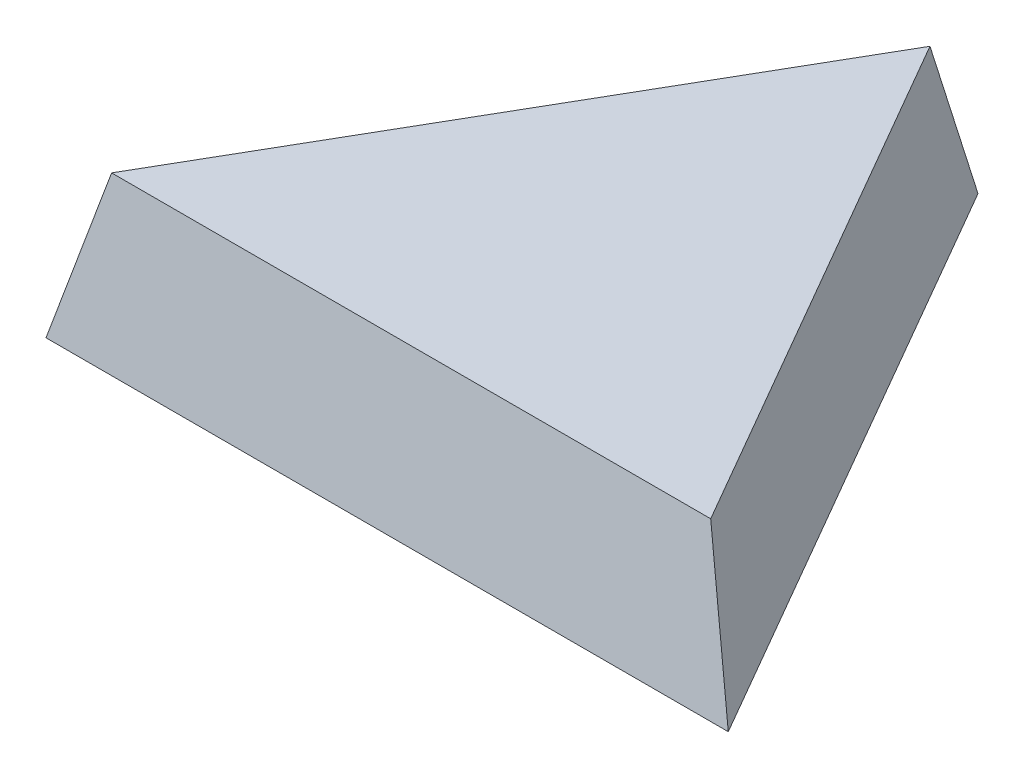
ISO-10303-21;
HEADER;
FILE_DESCRIPTION(('STEP AP214'),'2;1');
FILE_NAME('part.step','',(''),(''),'','','');
FILE_SCHEMA(('AUTOMOTIVE_DESIGN { 1 0 10303 214 1 1 1 1 }'));
ENDSEC;
DATA;
#1=APPLICATION_CONTEXT('core data for automotive mechanical design processes');
#2=APPLICATION_PROTOCOL_DEFINITION('international standard','automotive_design',2000,#1);
#3=PRODUCT_CONTEXT('',#1,'mechanical');
#4=PRODUCT('Part','Part','',(#3));
#5=PRODUCT_RELATED_PRODUCT_CATEGORY('part','',(#4));
#6=PRODUCT_DEFINITION_FORMATION('','',#4);
#7=PRODUCT_DEFINITION_CONTEXT('part definition',#1,'design');
#8=PRODUCT_DEFINITION('design','',#6,#7);
#9=PRODUCT_DEFINITION_SHAPE('','',#8);
#10=(LENGTH_UNIT() NAMED_UNIT(*) SI_UNIT(.MILLI.,.METRE.));
#11=(NAMED_UNIT(*) PLANE_ANGLE_UNIT() SI_UNIT($,.RADIAN.));
#12=(NAMED_UNIT(*) SI_UNIT($,.STERADIAN.) SOLID_ANGLE_UNIT());
#13=UNCERTAINTY_MEASURE_WITH_UNIT(LENGTH_MEASURE(1.E-05),#10,'distance_accuracy_value','');
#14=(GEOMETRIC_REPRESENTATION_CONTEXT(3) GLOBAL_UNCERTAINTY_ASSIGNED_CONTEXT((#13)) GLOBAL_UNIT_ASSIGNED_CONTEXT((#10,
#11,#12)) REPRESENTATION_CONTEXT('',''));
#15=CARTESIAN_POINT('',(0.,0.,0.));
#16=DIRECTION('',(0.,0.,1.));
#17=DIRECTION('',(1.,0.,0.));
#18=AXIS2_PLACEMENT_3D('',#15,#16,#17);
#19=CARTESIAN_POINT('',(-5.56626122879479,0.,0.855856628400123));
#20=DIRECTION('',(0.,0.156434465040231,0.987688340595138));
#21=DIRECTION('',(0.,-0.987688340595138,0.156434465040231));
#22=AXIS2_PLACEMENT_3D('',#19,#20,#21);
#23=PLANE('',#22);
#24=DIRECTION('',(1.,0.,0.));
#25=VECTOR('',#24,1.);
#26=CARTESIAN_POINT('',(-5.56626122879479,0.,0.855856628400123));
#27=LINE('',#26,#25);
#28=CARTESIAN_POINT('',(-5.56626122879479,0.,0.855856628400123));
#29=VERTEX_POINT('',#28);
#30=CARTESIAN_POINT('',(3.43373877120521,0.,0.855856628400123));
#31=VERTEX_POINT('',#30);
#32=EDGE_CURVE('E71',#29,#31,#27,.T.);
#33=ORIENTED_EDGE('',*,*,#32,.T.);
#34=DIRECTION('',(0.261522580671052,-0.953314176823257,0.150990132349598));
#35=VECTOR('',#34,1.);
#36=CARTESIAN_POINT('',(3.43373877120521,0.,0.855856628400123));
#37=LINE('',#36,#35);
#38=CARTESIAN_POINT('',(2.88507897566429,2.,0.53908774775105));
#39=VERTEX_POINT('',#38);
#40=EDGE_CURVE('E11',#39,#31,#37,.T.);
#41=ORIENTED_EDGE('',*,*,#40,.F.);
#42=DIRECTION('',(-1.,0.,0.));
#43=VECTOR('',#42,1.);
#44=CARTESIAN_POINT('',(-5.56626122879479,2.,0.53908774775105));
#45=LINE('',#44,#43);
#46=CARTESIAN_POINT('',(-5.01760143325388,2.,0.53908774775105));
#47=VERTEX_POINT('',#46);
#48=EDGE_CURVE('E83',#47,#39,#45,.F.);
#49=ORIENTED_EDGE('',*,*,#48,.F.);
#50=DIRECTION('',(-0.261522580671053,-0.953314176823257,0.150990132349598));
#51=VECTOR('',#50,1.);
#52=CARTESIAN_POINT('',(-5.56626122879479,0.,0.855856628400123));
#53=LINE('',#52,#51);
#54=EDGE_CURVE('E80',#47,#29,#53,.T.);
#55=ORIENTED_EDGE('',*,*,#54,.T.);
#56=EDGE_LOOP('',(#33,#41,#49,#55));
#57=FACE_BOUND('',#56,.T.);
#58=ADVANCED_FACE('F33',(#57),#23,.T.);
#59=CARTESIAN_POINT('',(3.43373877120521,0.,0.855856628400123));
#60=DIRECTION('',(0.855363193977087,0.156434465040231,-0.493844170297567));
#61=DIRECTION('',(-0.499999999999998,0.,-0.86602540378444));
#62=AXIS2_PLACEMENT_3D('',#59,#60,#61);
#63=PLANE('',#62);
#64=DIRECTION('',(-0.499999999999998,0.,-0.86602540378444));
#65=VECTOR('',#64,1.);
#66=CARTESIAN_POINT('',(3.43373877120521,0.,0.855856628400123));
#67=LINE('',#66,#65);
#68=CARTESIAN_POINT('',(-1.06626122879477,0.,-6.93837200565984));
#69=VERTEX_POINT('',#68);
#70=EDGE_CURVE('E68',#31,#69,#67,.T.);
#71=ORIENTED_EDGE('',*,*,#70,.T.);
#72=DIRECTION('',(0.,-0.953314176823257,-0.301980264699196));
#73=VECTOR('',#72,1.);
#74=CARTESIAN_POINT('',(-1.06626122879478,0.,-6.93837200565984));
#75=LINE('',#74,#73);
#76=CARTESIAN_POINT('',(-1.06626122879478,2.,-6.30483424436169));
#77=VERTEX_POINT('',#76);
#78=EDGE_CURVE('E42',#77,#69,#75,.T.);
#79=ORIENTED_EDGE('',*,*,#78,.F.);
#80=DIRECTION('',(0.499999999999998,0.,0.86602540378444));
#81=VECTOR('',#80,1.);
#82=CARTESIAN_POINT('',(3.15940887343475,2.,1.01424106872466));
#83=LINE('',#82,#81);
#84=EDGE_CURVE('E53',#39,#77,#83,.F.);
#85=ORIENTED_EDGE('',*,*,#84,.F.);
#86=ORIENTED_EDGE('',*,*,#40,.T.);
#87=EDGE_LOOP('',(#71,#79,#85,#86));
#88=FACE_BOUND('',#87,.T.);
#89=ADVANCED_FACE('F35',(#88),#63,.T.);
#90=CARTESIAN_POINT('',(-1.06626122879477,0.,-6.93837200565984));
#91=DIRECTION('',(-0.855363193977086,0.156434465040231,-0.493844170297569));
#92=DIRECTION('',(-0.500000000000001,0.,0.866025403784438));
#93=AXIS2_PLACEMENT_3D('',#90,#91,#92);
#94=PLANE('',#93);
#95=DIRECTION('',(-0.500000000000001,0.,0.866025403784438));
#96=VECTOR('',#95,1.);
#97=CARTESIAN_POINT('',(-1.06626122879477,0.,-6.93837200565984));
#98=LINE('',#97,#96);
#99=EDGE_CURVE('E72',#69,#29,#98,.T.);
#100=ORIENTED_EDGE('',*,*,#99,.T.);
#101=ORIENTED_EDGE('',*,*,#54,.F.);
#102=DIRECTION('',(0.500000000000001,0.,-0.866025403784438));
#103=VECTOR('',#102,1.);
#104=CARTESIAN_POINT('',(-0.791931331024317,2.,-6.77998756533531));
#105=LINE('',#104,#103);
#106=EDGE_CURVE('E37',#77,#47,#105,.F.);
#107=ORIENTED_EDGE('',*,*,#106,.F.);
#108=ORIENTED_EDGE('',*,*,#78,.T.);
#109=EDGE_LOOP('',(#100,#101,#107,#108));
#110=FACE_BOUND('',#109,.T.);
#111=ADVANCED_FACE('F89',(#110),#94,.T.);
#112=CARTESIAN_POINT('',(0.,2.,0.));
#113=DIRECTION('',(0.,1.,0.));
#114=DIRECTION('',(0.,0.,1.));
#115=AXIS2_PLACEMENT_3D('',#112,#113,#114);
#116=PLANE('',#115);
#117=ORIENTED_EDGE('',*,*,#48,.T.);
#118=ORIENTED_EDGE('',*,*,#84,.T.);
#119=ORIENTED_EDGE('',*,*,#106,.T.);
#120=EDGE_LOOP('',(#117,#118,#119));
#121=FACE_BOUND('',#120,.T.);
#122=ADVANCED_FACE('F87',(#121),#116,.T.);
#123=CARTESIAN_POINT('',(0.,0.,0.));
#124=DIRECTION('',(0.,1.,0.));
#125=DIRECTION('',(0.,0.,1.));
#126=AXIS2_PLACEMENT_3D('',#123,#124,#125);
#127=PLANE('',#126);
#128=ORIENTED_EDGE('',*,*,#32,.F.);
#129=ORIENTED_EDGE('',*,*,#99,.F.);
#130=ORIENTED_EDGE('',*,*,#70,.F.);
#131=EDGE_LOOP('',(#128,#129,#130));
#132=FACE_BOUND('',#131,.T.);
#133=ADVANCED_FACE('F69',(#132),#127,.F.);
#134=CLOSED_SHELL('',(#58,#89,#111,#122,#133));
#135=MANIFOLD_SOLID_BREP('B2',#134);
#136=ADVANCED_BREP_SHAPE_REPRESENTATION('',(#18,#135),#14);
#137=SHAPE_DEFINITION_REPRESENTATION(#9,#136);
ENDSEC;
END-ISO-10303-21;
